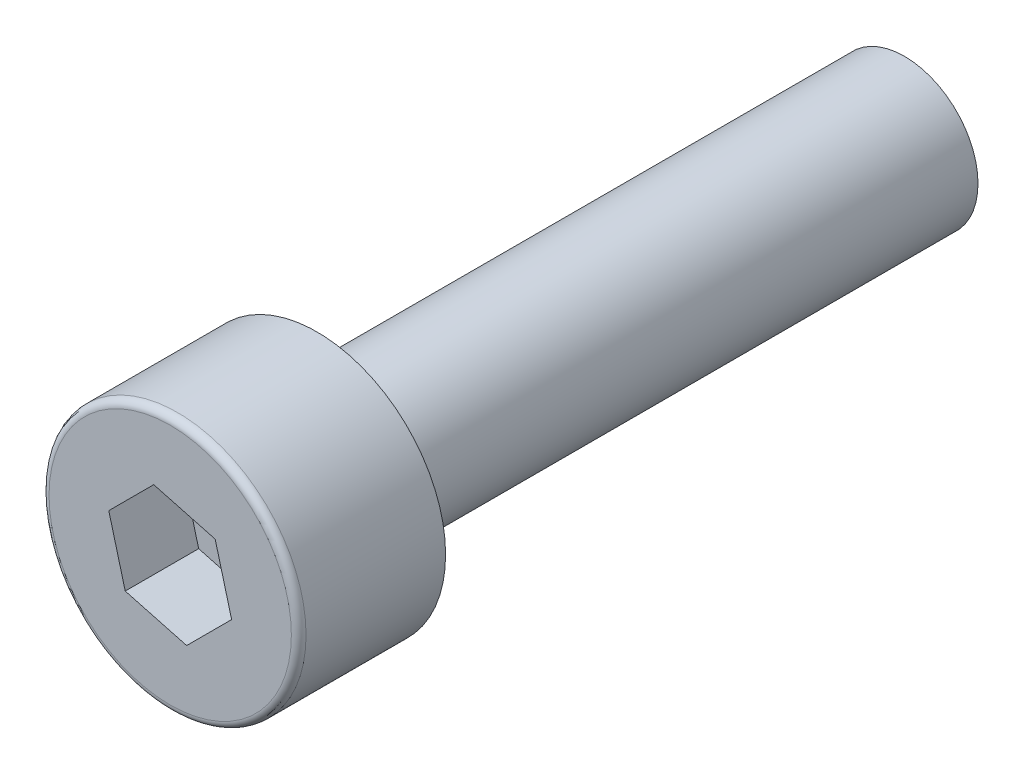
ISO-10303-21;
HEADER;
FILE_DESCRIPTION(('STEP AP214'),'2;1');
FILE_NAME('part.step','',(''),(''),'','','');
FILE_SCHEMA(('AUTOMOTIVE_DESIGN { 1 0 10303 214 1 1 1 1 }'));
ENDSEC;
DATA;
#1=APPLICATION_CONTEXT('core data for automotive mechanical design processes');
#2=APPLICATION_PROTOCOL_DEFINITION('international standard','automotive_design',2000,#1);
#3=PRODUCT_CONTEXT('',#1,'mechanical');
#4=PRODUCT('Part','Part','',(#3));
#5=PRODUCT_RELATED_PRODUCT_CATEGORY('part','',(#4));
#6=PRODUCT_DEFINITION_FORMATION('','',#4);
#7=PRODUCT_DEFINITION_CONTEXT('part definition',#1,'design');
#8=PRODUCT_DEFINITION('design','',#6,#7);
#9=PRODUCT_DEFINITION_SHAPE('','',#8);
#10=(LENGTH_UNIT() NAMED_UNIT(*) SI_UNIT(.MILLI.,.METRE.));
#11=(NAMED_UNIT(*) PLANE_ANGLE_UNIT() SI_UNIT($,.RADIAN.));
#12=(NAMED_UNIT(*) SI_UNIT($,.STERADIAN.) SOLID_ANGLE_UNIT());
#13=UNCERTAINTY_MEASURE_WITH_UNIT(LENGTH_MEASURE(1.E-05),#10,'distance_accuracy_value','');
#14=(GEOMETRIC_REPRESENTATION_CONTEXT(3) GLOBAL_UNCERTAINTY_ASSIGNED_CONTEXT((#13)) GLOBAL_UNIT_ASSIGNED_CONTEXT((#10,
#11,#12)) REPRESENTATION_CONTEXT('',''));
#15=CARTESIAN_POINT('',(0.,0.,0.));
#16=DIRECTION('',(0.,0.,1.));
#17=DIRECTION('',(1.,0.,0.));
#18=AXIS2_PLACEMENT_3D('',#15,#16,#17);
#19=CARTESIAN_POINT('',(0.,0.,0.));
#20=DIRECTION('',(0.,0.,1.));
#21=DIRECTION('',(1.,0.,0.));
#22=AXIS2_PLACEMENT_3D('',#19,#20,#21);
#23=PLANE('',#22);
#24=CARTESIAN_POINT('',(0.,0.,0.));
#25=DIRECTION('',(0.,0.,1.));
#26=DIRECTION('',(1.,0.,0.));
#27=AXIS2_PLACEMENT_3D('',#24,#25,#26);
#28=CIRCLE('',#27,3.5);
#29=CARTESIAN_POINT('',(3.5,0.,0.));
#30=VERTEX_POINT('',#29);
#31=EDGE_CURVE('E137',#30,#30,#28,.T.);
#32=ORIENTED_EDGE('',*,*,#31,.F.);
#33=EDGE_LOOP('',(#32));
#34=FACE_BOUND('',#33,.T.);
#35=CARTESIAN_POINT('',(0.,0.,0.));
#36=DIRECTION('',(0.,0.,1.));
#37=DIRECTION('',(1.,0.,0.));
#38=AXIS2_PLACEMENT_3D('',#35,#36,#37);
#39=CIRCLE('',#38,2.);
#40=CARTESIAN_POINT('',(2.,0.,0.));
#41=VERTEX_POINT('',#40);
#42=EDGE_CURVE('E145',#41,#41,#39,.F.);
#43=ORIENTED_EDGE('',*,*,#42,.F.);
#44=EDGE_LOOP('',(#43));
#45=FACE_BOUND('',#44,.T.);
#46=ADVANCED_FACE('F34',(#34,#45),#23,.F.);
#47=CARTESIAN_POINT('',(0.,0.,4.));
#48=DIRECTION('',(0.,0.,-1.));
#49=DIRECTION('',(-1.,0.,0.));
#50=AXIS2_PLACEMENT_3D('',#47,#48,#49);
#51=CYLINDRICAL_SURFACE('',#50,3.5);
#52=CARTESIAN_POINT('',(0.,0.,3.8));
#53=DIRECTION('',(0.,0.,1.));
#54=DIRECTION('',(1.,0.,0.));
#55=AXIS2_PLACEMENT_3D('',#52,#53,#54);
#56=CIRCLE('',#55,3.5);
#57=CARTESIAN_POINT('',(3.5,0.,3.8));
#58=VERTEX_POINT('',#57);
#59=EDGE_CURVE('E11',#58,#58,#56,.F.);
#60=ORIENTED_EDGE('',*,*,#59,.T.);
#61=EDGE_LOOP('',(#60));
#62=FACE_BOUND('',#61,.T.);
#63=ORIENTED_EDGE('',*,*,#31,.T.);
#64=EDGE_LOOP('',(#63));
#65=FACE_BOUND('',#64,.T.);
#66=ADVANCED_FACE('F164',(#62,#65),#51,.T.);
#67=CARTESIAN_POINT('',(0.,0.,4.));
#68=DIRECTION('',(0.,0.,1.));
#69=DIRECTION('',(1.,0.,0.));
#70=AXIS2_PLACEMENT_3D('',#67,#68,#69);
#71=PLANE('',#70);
#72=CARTESIAN_POINT('',(0.,0.,4.));
#73=DIRECTION('',(0.,0.,1.));
#74=DIRECTION('',(1.,0.,0.));
#75=AXIS2_PLACEMENT_3D('',#72,#73,#74);
#76=CIRCLE('',#75,3.3);
#77=CARTESIAN_POINT('',(3.3,0.,4.));
#78=VERTEX_POINT('',#77);
#79=EDGE_CURVE('E42',#78,#78,#76,.T.);
#80=ORIENTED_EDGE('',*,*,#79,.T.);
#81=EDGE_LOOP('',(#80));
#82=FACE_BOUND('',#81,.T.);
#83=DIRECTION('',(0.258819045102521,-0.965925826289068,0.));
#84=VECTOR('',#83,1.);
#85=CARTESIAN_POINT('',(-1.67303260747562,0.448287736084027,4.));
#86=LINE('',#85,#84);
#87=CARTESIAN_POINT('',(-1.67303260747562,0.448287736084027,4.));
#88=VERTEX_POINT('',#87);
#89=CARTESIAN_POINT('',(-1.22474487139159,-1.22474487139159,4.));
#90=VERTEX_POINT('',#89);
#91=EDGE_CURVE('E49',#88,#90,#86,.T.);
#92=ORIENTED_EDGE('',*,*,#91,.F.);
#93=DIRECTION('',(-0.707106781186547,-0.707106781186548,0.));
#94=VECTOR('',#93,1.);
#95=CARTESIAN_POINT('',(-0.448287736084027,1.67303260747562,4.));
#96=LINE('',#95,#94);
#97=CARTESIAN_POINT('',(-0.448287736084027,1.67303260747562,4.));
#98=VERTEX_POINT('',#97);
#99=EDGE_CURVE('E133',#98,#88,#96,.T.);
#100=ORIENTED_EDGE('',*,*,#99,.F.);
#101=DIRECTION('',(-0.965925826289068,0.258819045102521,0.));
#102=VECTOR('',#101,1.);
#103=CARTESIAN_POINT('',(1.22474487139159,1.22474487139159,4.));
#104=LINE('',#103,#102);
#105=CARTESIAN_POINT('',(1.22474487139159,1.22474487139159,4.));
#106=VERTEX_POINT('',#105);
#107=EDGE_CURVE('E131',#106,#98,#104,.T.);
#108=ORIENTED_EDGE('',*,*,#107,.F.);
#109=DIRECTION('',(-0.258819045102521,0.965925826289068,0.));
#110=VECTOR('',#109,1.);
#111=CARTESIAN_POINT('',(1.67303260747562,-0.448287736084027,4.));
#112=LINE('',#111,#110);
#113=CARTESIAN_POINT('',(1.67303260747562,-0.448287736084027,4.));
#114=VERTEX_POINT('',#113);
#115=EDGE_CURVE('E97',#114,#106,#112,.T.);
#116=ORIENTED_EDGE('',*,*,#115,.F.);
#117=DIRECTION('',(0.707106781186547,0.707106781186548,0.));
#118=VECTOR('',#117,1.);
#119=CARTESIAN_POINT('',(0.448287736084026,-1.67303260747562,4.));
#120=LINE('',#119,#118);
#121=CARTESIAN_POINT('',(0.448287736084026,-1.67303260747562,4.));
#122=VERTEX_POINT('',#121);
#123=EDGE_CURVE('E127',#122,#114,#120,.T.);
#124=ORIENTED_EDGE('',*,*,#123,.F.);
#125=DIRECTION('',(0.965925826289068,-0.258819045102521,0.));
#126=VECTOR('',#125,1.);
#127=CARTESIAN_POINT('',(-1.22474487139159,-1.22474487139159,4.));
#128=LINE('',#127,#126);
#129=EDGE_CURVE('E123',#90,#122,#128,.T.);
#130=ORIENTED_EDGE('',*,*,#129,.F.);
#131=EDGE_LOOP('',(#92,#100,#108,#116,#124,#130));
#132=FACE_BOUND('',#131,.T.);
#133=ADVANCED_FACE('F150',(#82,#132),#71,.T.);
#134=CARTESIAN_POINT('',(-1.67303260747562,0.448287736084027,2.));
#135=DIRECTION('',(-0.965925826289068,-0.258819045102521,0.));
#136=DIRECTION('',(0.258819045102521,-0.965925826289068,0.));
#137=AXIS2_PLACEMENT_3D('',#134,#135,#136);
#138=PLANE('',#137);
#139=ORIENTED_EDGE('',*,*,#91,.T.);
#140=DIRECTION('',(0.,0.,1.));
#141=VECTOR('',#140,1.);
#142=CARTESIAN_POINT('',(-1.22474487139159,-1.22474487139159,2.));
#143=LINE('',#142,#141);
#144=CARTESIAN_POINT('',(-1.22474487139159,-1.22474487139159,2.));
#145=VERTEX_POINT('',#144);
#146=EDGE_CURVE('E79',#145,#90,#143,.T.);
#147=ORIENTED_EDGE('',*,*,#146,.F.);
#148=DIRECTION('',(0.258819045102521,-0.965925826289068,0.));
#149=VECTOR('',#148,1.);
#150=CARTESIAN_POINT('',(-1.67303260747562,0.448287736084027,2.));
#151=LINE('',#150,#149);
#152=CARTESIAN_POINT('',(-1.67303260747562,0.448287736084027,2.));
#153=VERTEX_POINT('',#152);
#154=EDGE_CURVE('E135',#153,#145,#151,.T.);
#155=ORIENTED_EDGE('',*,*,#154,.F.);
#156=DIRECTION('',(0.,0.,1.));
#157=VECTOR('',#156,1.);
#158=CARTESIAN_POINT('',(-1.67303260747562,0.448287736084027,2.));
#159=LINE('',#158,#157);
#160=EDGE_CURVE('E57',#153,#88,#159,.T.);
#161=ORIENTED_EDGE('',*,*,#160,.T.);
#162=EDGE_LOOP('',(#139,#147,#155,#161));
#163=FACE_BOUND('',#162,.T.);
#164=ADVANCED_FACE('F176',(#163),#138,.F.);
#165=CARTESIAN_POINT('',(-0.448287736084027,1.67303260747562,2.));
#166=DIRECTION('',(-0.707106781186548,0.707106781186547,0.));
#167=DIRECTION('',(-0.707106781186547,-0.707106781186548,0.));
#168=AXIS2_PLACEMENT_3D('',#165,#166,#167);
#169=PLANE('',#168);
#170=ORIENTED_EDGE('',*,*,#99,.T.);
#171=ORIENTED_EDGE('',*,*,#160,.F.);
#172=DIRECTION('',(-0.707106781186547,-0.707106781186548,0.));
#173=VECTOR('',#172,1.);
#174=CARTESIAN_POINT('',(-0.448287736084027,1.67303260747562,2.));
#175=LINE('',#174,#173);
#176=CARTESIAN_POINT('',(-0.448287736084027,1.67303260747562,2.));
#177=VERTEX_POINT('',#176);
#178=EDGE_CURVE('E109',#177,#153,#175,.T.);
#179=ORIENTED_EDGE('',*,*,#178,.F.);
#180=DIRECTION('',(0.,0.,1.));
#181=VECTOR('',#180,1.);
#182=CARTESIAN_POINT('',(-0.448287736084027,1.67303260747562,2.));
#183=LINE('',#182,#181);
#184=EDGE_CURVE('E101',#177,#98,#183,.T.);
#185=ORIENTED_EDGE('',*,*,#184,.T.);
#186=EDGE_LOOP('',(#170,#171,#179,#185));
#187=FACE_BOUND('',#186,.T.);
#188=ADVANCED_FACE('F179',(#187),#169,.F.);
#189=CARTESIAN_POINT('',(1.22474487139159,1.22474487139159,2.));
#190=DIRECTION('',(0.258819045102521,0.965925826289068,0.));
#191=DIRECTION('',(-0.965925826289068,0.258819045102521,0.));
#192=AXIS2_PLACEMENT_3D('',#189,#190,#191);
#193=PLANE('',#192);
#194=ORIENTED_EDGE('',*,*,#107,.T.);
#195=ORIENTED_EDGE('',*,*,#184,.F.);
#196=DIRECTION('',(-0.965925826289068,0.258819045102521,0.));
#197=VECTOR('',#196,1.);
#198=CARTESIAN_POINT('',(1.22474487139159,1.22474487139159,2.));
#199=LINE('',#198,#197);
#200=CARTESIAN_POINT('',(1.22474487139159,1.22474487139159,2.));
#201=VERTEX_POINT('',#200);
#202=EDGE_CURVE('E105',#201,#177,#199,.T.);
#203=ORIENTED_EDGE('',*,*,#202,.F.);
#204=DIRECTION('',(0.,0.,1.));
#205=VECTOR('',#204,1.);
#206=CARTESIAN_POINT('',(1.22474487139159,1.22474487139159,2.));
#207=LINE('',#206,#205);
#208=EDGE_CURVE('E90',#201,#106,#207,.T.);
#209=ORIENTED_EDGE('',*,*,#208,.T.);
#210=EDGE_LOOP('',(#194,#195,#203,#209));
#211=FACE_BOUND('',#210,.T.);
#212=ADVANCED_FACE('F106',(#211),#193,.F.);
#213=CARTESIAN_POINT('',(1.67303260747562,-0.448287736084027,2.));
#214=DIRECTION('',(0.965925826289068,0.258819045102521,0.));
#215=DIRECTION('',(-0.258819045102521,0.965925826289068,0.));
#216=AXIS2_PLACEMENT_3D('',#213,#214,#215);
#217=PLANE('',#216);
#218=ORIENTED_EDGE('',*,*,#115,.T.);
#219=ORIENTED_EDGE('',*,*,#208,.F.);
#220=DIRECTION('',(-0.258819045102521,0.965925826289068,0.));
#221=VECTOR('',#220,1.);
#222=CARTESIAN_POINT('',(1.67303260747562,-0.448287736084027,2.));
#223=LINE('',#222,#221);
#224=CARTESIAN_POINT('',(1.67303260747562,-0.448287736084027,2.));
#225=VERTEX_POINT('',#224);
#226=EDGE_CURVE('E94',#225,#201,#223,.T.);
#227=ORIENTED_EDGE('',*,*,#226,.F.);
#228=DIRECTION('',(0.,0.,1.));
#229=VECTOR('',#228,1.);
#230=CARTESIAN_POINT('',(1.67303260747562,-0.448287736084027,2.));
#231=LINE('',#230,#229);
#232=EDGE_CURVE('E102',#225,#114,#231,.T.);
#233=ORIENTED_EDGE('',*,*,#232,.T.);
#234=EDGE_LOOP('',(#218,#219,#227,#233));
#235=FACE_BOUND('',#234,.T.);
#236=ADVANCED_FACE('F92',(#235),#217,.F.);
#237=CARTESIAN_POINT('',(0.448287736084026,-1.67303260747562,2.));
#238=DIRECTION('',(0.707106781186548,-0.707106781186547,0.));
#239=DIRECTION('',(0.707106781186547,0.707106781186548,0.));
#240=AXIS2_PLACEMENT_3D('',#237,#238,#239);
#241=PLANE('',#240);
#242=ORIENTED_EDGE('',*,*,#123,.T.);
#243=ORIENTED_EDGE('',*,*,#232,.F.);
#244=DIRECTION('',(0.707106781186547,0.707106781186548,0.));
#245=VECTOR('',#244,1.);
#246=CARTESIAN_POINT('',(0.448287736084026,-1.67303260747562,2.));
#247=LINE('',#246,#245);
#248=CARTESIAN_POINT('',(0.448287736084026,-1.67303260747562,2.));
#249=VERTEX_POINT('',#248);
#250=EDGE_CURVE('E115',#249,#225,#247,.T.);
#251=ORIENTED_EDGE('',*,*,#250,.F.);
#252=DIRECTION('',(0.,0.,1.));
#253=VECTOR('',#252,1.);
#254=CARTESIAN_POINT('',(0.448287736084026,-1.67303260747562,2.));
#255=LINE('',#254,#253);
#256=EDGE_CURVE('E140',#249,#122,#255,.T.);
#257=ORIENTED_EDGE('',*,*,#256,.T.);
#258=EDGE_LOOP('',(#242,#243,#251,#257));
#259=FACE_BOUND('',#258,.T.);
#260=ADVANCED_FACE('F183',(#259),#241,.F.);
#261=CARTESIAN_POINT('',(-1.22474487139159,-1.22474487139159,2.));
#262=DIRECTION('',(-0.258819045102521,-0.965925826289068,0.));
#263=DIRECTION('',(0.965925826289068,-0.258819045102521,0.));
#264=AXIS2_PLACEMENT_3D('',#261,#262,#263);
#265=PLANE('',#264);
#266=ORIENTED_EDGE('',*,*,#129,.T.);
#267=ORIENTED_EDGE('',*,*,#256,.F.);
#268=DIRECTION('',(0.965925826289068,-0.258819045102521,0.));
#269=VECTOR('',#268,1.);
#270=CARTESIAN_POINT('',(-1.22474487139159,-1.22474487139159,2.));
#271=LINE('',#270,#269);
#272=EDGE_CURVE('E117',#145,#249,#271,.T.);
#273=ORIENTED_EDGE('',*,*,#272,.F.);
#274=ORIENTED_EDGE('',*,*,#146,.T.);
#275=EDGE_LOOP('',(#266,#267,#273,#274));
#276=FACE_BOUND('',#275,.T.);
#277=ADVANCED_FACE('F180',(#276),#265,.F.);
#278=CARTESIAN_POINT('',(0.,0.,2.));
#279=DIRECTION('',(0.,0.,1.));
#280=DIRECTION('',(1.,0.,0.));
#281=AXIS2_PLACEMENT_3D('',#278,#279,#280);
#282=PLANE('',#281);
#283=ORIENTED_EDGE('',*,*,#154,.T.);
#284=ORIENTED_EDGE('',*,*,#272,.T.);
#285=ORIENTED_EDGE('',*,*,#250,.T.);
#286=ORIENTED_EDGE('',*,*,#226,.T.);
#287=ORIENTED_EDGE('',*,*,#202,.T.);
#288=ORIENTED_EDGE('',*,*,#178,.T.);
#289=EDGE_LOOP('',(#283,#284,#285,#286,#287,#288));
#290=FACE_BOUND('',#289,.T.);
#291=ADVANCED_FACE('F112',(#290),#282,.T.);
#292=CARTESIAN_POINT('',(0.,0.,-16.));
#293=DIRECTION('',(0.,0.,1.));
#294=DIRECTION('',(1.,0.,0.));
#295=AXIS2_PLACEMENT_3D('',#292,#293,#294);
#296=CYLINDRICAL_SURFACE('',#295,2.);
#297=CARTESIAN_POINT('',(0.,0.,-16.));
#298=DIRECTION('',(0.,0.,-1.));
#299=DIRECTION('',(-1.,0.,0.));
#300=AXIS2_PLACEMENT_3D('',#297,#298,#299);
#301=CIRCLE('',#300,2.);
#302=CARTESIAN_POINT('',(-2.,0.,-16.));
#303=VERTEX_POINT('',#302);
#304=EDGE_CURVE('E124',#303,#303,#301,.T.);
#305=ORIENTED_EDGE('',*,*,#304,.F.);
#306=EDGE_LOOP('',(#305));
#307=FACE_BOUND('',#306,.T.);
#308=ORIENTED_EDGE('',*,*,#42,.T.);
#309=EDGE_LOOP('',(#308));
#310=FACE_BOUND('',#309,.T.);
#311=ADVANCED_FACE('F159',(#307,#310),#296,.T.);
#312=CARTESIAN_POINT('',(0.,0.,-16.));
#313=DIRECTION('',(0.,0.,-1.));
#314=DIRECTION('',(-1.,0.,0.));
#315=AXIS2_PLACEMENT_3D('',#312,#313,#314);
#316=PLANE('',#315);
#317=ORIENTED_EDGE('',*,*,#304,.T.);
#318=EDGE_LOOP('',(#317));
#319=FACE_BOUND('',#318,.T.);
#320=ADVANCED_FACE('F154',(#319),#316,.T.);
#321=CARTESIAN_POINT('',(0.,0.,3.8));
#322=DIRECTION('',(0.,0.,1.));
#323=DIRECTION('',(1.,0.,0.));
#324=AXIS2_PLACEMENT_3D('',#321,#322,#323);
#325=TOROIDAL_SURFACE('',#324,3.3,0.2);
#326=ORIENTED_EDGE('',*,*,#59,.F.);
#327=EDGE_LOOP('',(#326));
#328=FACE_BOUND('',#327,.T.);
#329=ORIENTED_EDGE('',*,*,#79,.F.);
#330=EDGE_LOOP('',(#329));
#331=FACE_BOUND('',#330,.T.);
#332=ADVANCED_FACE('F36',(#328,#331),#325,.T.);
#333=CLOSED_SHELL('',(#46,#66,#133,#164,#188,#212,#236,#260,#277,#291,#311,#320,#332));
#334=MANIFOLD_SOLID_BREP('B2',#333);
#335=ADVANCED_BREP_SHAPE_REPRESENTATION('',(#18,#334),#14);
#336=SHAPE_DEFINITION_REPRESENTATION(#9,#335);
ENDSEC;
END-ISO-10303-21;
